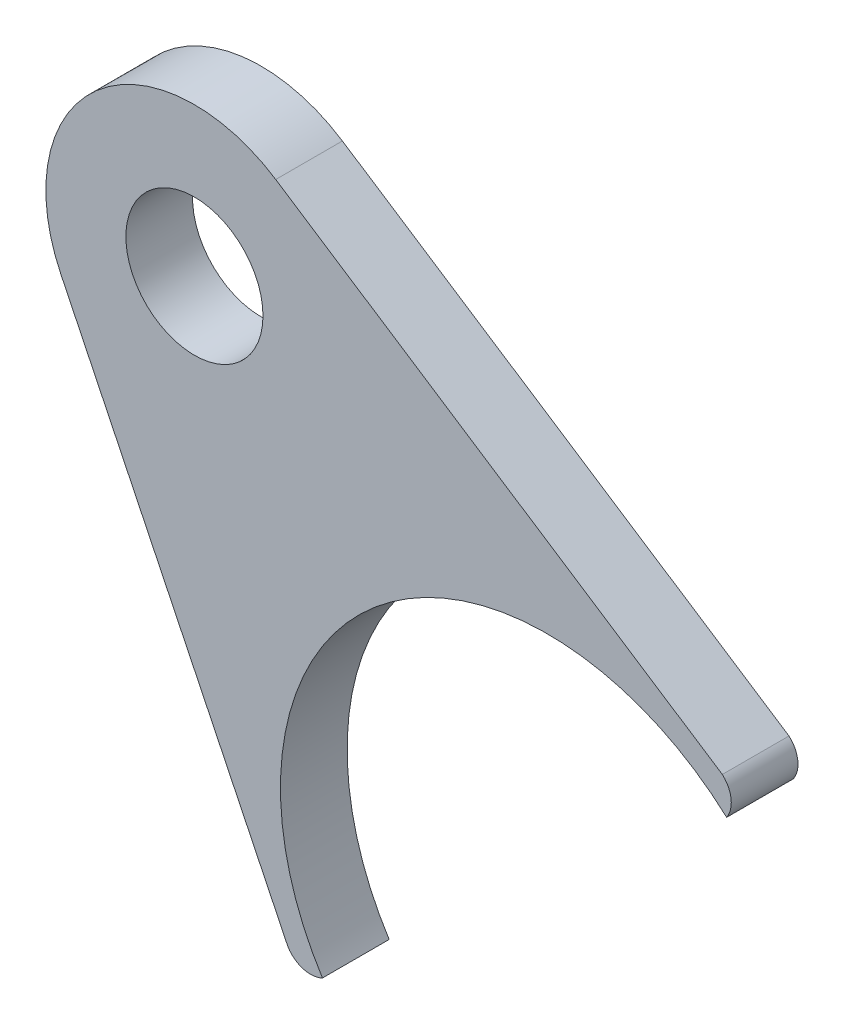
ISO-10303-21;
HEADER;
FILE_DESCRIPTION(('STEP AP214'),'2;1');
FILE_NAME('part.step','',(''),(''),'','','');
FILE_SCHEMA(('AUTOMOTIVE_DESIGN { 1 0 10303 214 1 1 1 1 }'));
ENDSEC;
DATA;
#1=APPLICATION_CONTEXT('core data for automotive mechanical design processes');
#2=APPLICATION_PROTOCOL_DEFINITION('international standard','automotive_design',2000,#1);
#3=PRODUCT_CONTEXT('',#1,'mechanical');
#4=PRODUCT('Part','Part','',(#3));
#5=PRODUCT_RELATED_PRODUCT_CATEGORY('part','',(#4));
#6=PRODUCT_DEFINITION_FORMATION('','',#4);
#7=PRODUCT_DEFINITION_CONTEXT('part definition',#1,'design');
#8=PRODUCT_DEFINITION('design','',#6,#7);
#9=PRODUCT_DEFINITION_SHAPE('','',#8);
#10=(LENGTH_UNIT() NAMED_UNIT(*) SI_UNIT(.MILLI.,.METRE.));
#11=(NAMED_UNIT(*) PLANE_ANGLE_UNIT() SI_UNIT($,.RADIAN.));
#12=(NAMED_UNIT(*) SI_UNIT($,.STERADIAN.) SOLID_ANGLE_UNIT());
#13=UNCERTAINTY_MEASURE_WITH_UNIT(LENGTH_MEASURE(1.E-05),#10,'distance_accuracy_value','');
#14=(GEOMETRIC_REPRESENTATION_CONTEXT(3) GLOBAL_UNCERTAINTY_ASSIGNED_CONTEXT((#13)) GLOBAL_UNIT_ASSIGNED_CONTEXT((#10,
#11,#12)) REPRESENTATION_CONTEXT('',''));
#15=CARTESIAN_POINT('',(0.,0.,0.));
#16=DIRECTION('',(0.,0.,1.));
#17=DIRECTION('',(1.,0.,0.));
#18=AXIS2_PLACEMENT_3D('',#15,#16,#17);
#19=CARTESIAN_POINT('',(7.490430135458,10.1196279800235,3.175));
#20=DIRECTION('',(0.,0.,1.));
#21=DIRECTION('',(1.,0.,0.));
#22=AXIS2_PLACEMENT_3D('',#19,#20,#21);
#23=PLANE('',#22);
#24=CARTESIAN_POINT('',(7.490430135458,10.1196279800235,3.175));
#25=DIRECTION('',(0.,0.,1.));
#26=DIRECTION('',(1.,0.,0.));
#27=AXIS2_PLACEMENT_3D('',#24,#25,#26);
#28=CIRCLE('',#27,1.27000000000002);
#29=CARTESIAN_POINT('',(8.54057723093058,9.40542137275168,3.175));
#30=VERTEX_POINT('',#29);
#31=CARTESIAN_POINT('',(8.33283083199815,11.0700284569114,3.175));
#32=VERTEX_POINT('',#31);
#33=EDGE_CURVE('E161',#30,#32,#28,.T.);
#34=ORIENTED_EDGE('',*,*,#33,.T.);
#35=DIRECTION('',(-0.836997984145,0.54720597085303,0.));
#36=VECTOR('',#35,1.);
#37=CARTESIAN_POINT('',(8.33283083199815,11.0700284569114,3.175));
#38=LINE('',#37,#36);
#39=CARTESIAN_POINT('',(-12.9296405080321,24.9708400392011,3.175));
#40=VERTEX_POINT('',#39);
#41=EDGE_CURVE('E108',#32,#40,#38,.T.);
#42=ORIENTED_EDGE('',*,*,#41,.T.);
#43=CARTESIAN_POINT('',(-16.8005208252494,19.0499999991578,3.175));
#44=DIRECTION('',(0.,0.,1.));
#45=DIRECTION('',(1.,0.,0.));
#46=AXIS2_PLACEMENT_3D('',#43,#44,#45);
#47=CIRCLE('',#46,7.07390000000001);
#48=CARTESIAN_POINT('',(-23.1672470230934,15.9670049080677,3.175));
#49=VERTEX_POINT('',#48);
#50=EDGE_CURVE('E121',#40,#49,#47,.T.);
#51=ORIENTED_EDGE('',*,*,#50,.T.);
#52=DIRECTION('',(0.435826784530473,-0.90003056275097,0.));
#53=VECTOR('',#52,1.);
#54=CARTESIAN_POINT('',(-12.3465290808871,-6.37897566167989,3.175));
#55=LINE('',#54,#53);
#56=CARTESIAN_POINT('',(-12.3465290808871,-6.3789756616799,3.175));
#57=VERTEX_POINT('',#56);
#58=EDGE_CURVE('E115',#49,#57,#55,.T.);
#59=ORIENTED_EDGE('',*,*,#58,.T.);
#60=CARTESIAN_POINT('',(-11.2701074977406,-5.7050197466999,3.175));
#61=DIRECTION('',(0.,0.,1.));
#62=DIRECTION('',(1.,0.,0.));
#63=AXIS2_PLACEMENT_3D('',#60,#61,#62);
#64=CIRCLE('',#63,1.27000000000005);
#65=CARTESIAN_POINT('',(-10.7045899306855,-6.84216084671875,3.175));
#66=VERTEX_POINT('',#65);
#67=EDGE_CURVE('E119',#57,#66,#64,.T.);
#68=ORIENTED_EDGE('',*,*,#67,.T.);
#69=CARTESIAN_POINT('',(0.,0.,3.175));
#70=DIRECTION('',(0.,0.,-1.));
#71=DIRECTION('',(1.,0.,0.));
#72=AXIS2_PLACEMENT_3D('',#69,#70,#71);
#73=CIRCLE('',#72,12.7044642010792);
#74=EDGE_CURVE('E71',#66,#30,#73,.T.);
#75=ORIENTED_EDGE('',*,*,#74,.T.);
#76=EDGE_LOOP('',(#34,#42,#51,#59,#68,#75));
#77=FACE_BOUND('',#76,.T.);
#78=CARTESIAN_POINT('',(-16.8005208252494,19.0499999991578,3.175));
#79=DIRECTION('',(0.,0.,1.));
#80=DIRECTION('',(1.,0.,0.));
#81=AXIS2_PLACEMENT_3D('',#78,#79,#80);
#82=CIRCLE('',#81,3.26390000000004);
#83=CARTESIAN_POINT('',(-13.5366208252493,19.0499999991578,3.175));
#84=VERTEX_POINT('',#83);
#85=EDGE_CURVE('E149',#84,#84,#82,.T.);
#86=ORIENTED_EDGE('',*,*,#85,.F.);
#87=EDGE_LOOP('',(#86));
#88=FACE_BOUND('',#87,.T.);
#89=ADVANCED_FACE('F53',(#77,#88),#23,.T.);
#90=CARTESIAN_POINT('',(7.490430135458,10.1196279800235,0.));
#91=DIRECTION('',(0.,0.,1.));
#92=DIRECTION('',(1.,0.,0.));
#93=AXIS2_PLACEMENT_3D('',#90,#91,#92);
#94=PLANE('',#93);
#95=CARTESIAN_POINT('',(7.490430135458,10.1196279800235,0.));
#96=DIRECTION('',(0.,0.,1.));
#97=DIRECTION('',(1.,0.,0.));
#98=AXIS2_PLACEMENT_3D('',#95,#96,#97);
#99=CIRCLE('',#98,1.27000000000002);
#100=CARTESIAN_POINT('',(8.54057723093058,9.40542137275168,0.));
#101=VERTEX_POINT('',#100);
#102=CARTESIAN_POINT('',(8.33283083199815,11.0700284569114,0.));
#103=VERTEX_POINT('',#102);
#104=EDGE_CURVE('E144',#101,#103,#99,.T.);
#105=ORIENTED_EDGE('',*,*,#104,.F.);
#106=CARTESIAN_POINT('',(0.,0.,0.));
#107=DIRECTION('',(0.,0.,-1.));
#108=DIRECTION('',(1.,0.,0.));
#109=AXIS2_PLACEMENT_3D('',#106,#107,#108);
#110=CIRCLE('',#109,12.7044642010792);
#111=CARTESIAN_POINT('',(-10.7045899306855,-6.84216084671875,0.));
#112=VERTEX_POINT('',#111);
#113=EDGE_CURVE('E100',#112,#101,#110,.T.);
#114=ORIENTED_EDGE('',*,*,#113,.F.);
#115=CARTESIAN_POINT('',(-11.2701074977406,-5.7050197466999,0.));
#116=DIRECTION('',(0.,0.,1.));
#117=DIRECTION('',(1.,0.,0.));
#118=AXIS2_PLACEMENT_3D('',#115,#116,#117);
#119=CIRCLE('',#118,1.27000000000005);
#120=CARTESIAN_POINT('',(-12.3465290808871,-6.3789756616799,0.));
#121=VERTEX_POINT('',#120);
#122=EDGE_CURVE('E94',#121,#112,#119,.T.);
#123=ORIENTED_EDGE('',*,*,#122,.F.);
#124=DIRECTION('',(0.435826784530473,-0.90003056275097,0.));
#125=VECTOR('',#124,1.);
#126=CARTESIAN_POINT('',(-12.3465290808871,-6.37897566167989,0.));
#127=LINE('',#126,#125);
#128=CARTESIAN_POINT('',(-23.1672470230934,15.9670049080677,0.));
#129=VERTEX_POINT('',#128);
#130=EDGE_CURVE('E130',#129,#121,#127,.T.);
#131=ORIENTED_EDGE('',*,*,#130,.F.);
#132=CARTESIAN_POINT('',(-16.8005208252494,19.0499999991578,0.));
#133=DIRECTION('',(0.,0.,1.));
#134=DIRECTION('',(1.,0.,0.));
#135=AXIS2_PLACEMENT_3D('',#132,#133,#134);
#136=CIRCLE('',#135,7.07390000000001);
#137=CARTESIAN_POINT('',(-12.9296405080321,24.9708400392011,0.));
#138=VERTEX_POINT('',#137);
#139=EDGE_CURVE('E152',#138,#129,#136,.T.);
#140=ORIENTED_EDGE('',*,*,#139,.F.);
#141=DIRECTION('',(-0.836997984145,0.54720597085303,0.));
#142=VECTOR('',#141,1.);
#143=CARTESIAN_POINT('',(8.33283083199815,11.0700284569114,0.));
#144=LINE('',#143,#142);
#145=EDGE_CURVE('E148',#103,#138,#144,.T.);
#146=ORIENTED_EDGE('',*,*,#145,.F.);
#147=EDGE_LOOP('',(#105,#114,#123,#131,#140,#146));
#148=FACE_BOUND('',#147,.T.);
#149=CARTESIAN_POINT('',(-16.8005208252494,19.0499999991578,0.));
#150=DIRECTION('',(0.,0.,1.));
#151=DIRECTION('',(1.,0.,0.));
#152=AXIS2_PLACEMENT_3D('',#149,#150,#151);
#153=CIRCLE('',#152,3.26390000000004);
#154=CARTESIAN_POINT('',(-13.5366208252493,19.0499999991578,0.));
#155=VERTEX_POINT('',#154);
#156=EDGE_CURVE('E259',#155,#155,#153,.T.);
#157=ORIENTED_EDGE('',*,*,#156,.T.);
#158=EDGE_LOOP('',(#157));
#159=FACE_BOUND('',#158,.T.);
#160=ADVANCED_FACE('F175',(#148,#159),#94,.F.);
#161=CARTESIAN_POINT('',(7.490430135458,10.1196279800235,3.175));
#162=DIRECTION('',(0.,0.,-1.));
#163=DIRECTION('',(-1.,0.,0.));
#164=AXIS2_PLACEMENT_3D('',#161,#162,#163);
#165=CYLINDRICAL_SURFACE('',#164,1.27000000000002);
#166=ORIENTED_EDGE('',*,*,#104,.T.);
#167=DIRECTION('',(0.,0.,-1.));
#168=VECTOR('',#167,1.);
#169=CARTESIAN_POINT('',(8.33283083199815,11.0700284569114,3.175));
#170=LINE('',#169,#168);
#171=EDGE_CURVE('E13',#32,#103,#170,.T.);
#172=ORIENTED_EDGE('',*,*,#171,.F.);
#173=ORIENTED_EDGE('',*,*,#33,.F.);
#174=DIRECTION('',(0.,0.,-1.));
#175=VECTOR('',#174,1.);
#176=CARTESIAN_POINT('',(8.54057723093058,9.40542137275168,3.175));
#177=LINE('',#176,#175);
#178=EDGE_CURVE('E140',#30,#101,#177,.T.);
#179=ORIENTED_EDGE('',*,*,#178,.T.);
#180=EDGE_LOOP('',(#166,#172,#173,#179));
#181=FACE_BOUND('',#180,.T.);
#182=ADVANCED_FACE('F55',(#181),#165,.T.);
#183=CARTESIAN_POINT('',(8.33283083199815,11.0700284569114,3.175));
#184=DIRECTION('',(-0.54720597085303,-0.836997984145,0.));
#185=DIRECTION('',(0.836997984145,-0.54720597085303,0.));
#186=AXIS2_PLACEMENT_3D('',#183,#184,#185);
#187=PLANE('',#186);
#188=ORIENTED_EDGE('',*,*,#145,.T.);
#189=DIRECTION('',(0.,0.,-1.));
#190=VECTOR('',#189,1.);
#191=CARTESIAN_POINT('',(-12.9296405080321,24.9708400392011,3.175));
#192=LINE('',#191,#190);
#193=EDGE_CURVE('E63',#40,#138,#192,.T.);
#194=ORIENTED_EDGE('',*,*,#193,.F.);
#195=ORIENTED_EDGE('',*,*,#41,.F.);
#196=ORIENTED_EDGE('',*,*,#171,.T.);
#197=EDGE_LOOP('',(#188,#194,#195,#196));
#198=FACE_BOUND('',#197,.T.);
#199=ADVANCED_FACE('F200',(#198),#187,.F.);
#200=CARTESIAN_POINT('',(-16.8005208252494,19.0499999991578,3.175));
#201=DIRECTION('',(0.,0.,-1.));
#202=DIRECTION('',(-1.,0.,0.));
#203=AXIS2_PLACEMENT_3D('',#200,#201,#202);
#204=CYLINDRICAL_SURFACE('',#203,7.07390000000001);
#205=ORIENTED_EDGE('',*,*,#139,.T.);
#206=DIRECTION('',(0.,0.,-1.));
#207=VECTOR('',#206,1.);
#208=CARTESIAN_POINT('',(-23.1672470230934,15.9670049080677,3.175));
#209=LINE('',#208,#207);
#210=EDGE_CURVE('E132',#49,#129,#209,.T.);
#211=ORIENTED_EDGE('',*,*,#210,.F.);
#212=ORIENTED_EDGE('',*,*,#50,.F.);
#213=ORIENTED_EDGE('',*,*,#193,.T.);
#214=EDGE_LOOP('',(#205,#211,#212,#213));
#215=FACE_BOUND('',#214,.T.);
#216=ADVANCED_FACE('F172',(#215),#204,.T.);
#217=CARTESIAN_POINT('',(-12.3465290808871,-6.37897566167989,3.175));
#218=DIRECTION('',(0.900030562750971,0.435826784530473,0.));
#219=DIRECTION('',(-0.435826784530473,0.900030562750971,0.));
#220=AXIS2_PLACEMENT_3D('',#217,#218,#219);
#221=PLANE('',#220);
#222=ORIENTED_EDGE('',*,*,#130,.T.);
#223=DIRECTION('',(0.,0.,-1.));
#224=VECTOR('',#223,1.);
#225=CARTESIAN_POINT('',(-12.3465290808871,-6.3789756616799,3.175));
#226=LINE('',#225,#224);
#227=EDGE_CURVE('E127',#57,#121,#226,.T.);
#228=ORIENTED_EDGE('',*,*,#227,.F.);
#229=ORIENTED_EDGE('',*,*,#58,.F.);
#230=ORIENTED_EDGE('',*,*,#210,.T.);
#231=EDGE_LOOP('',(#222,#228,#229,#230));
#232=FACE_BOUND('',#231,.T.);
#233=ADVANCED_FACE('F128',(#232),#221,.F.);
#234=CARTESIAN_POINT('',(-11.2701074977406,-5.7050197466999,3.175));
#235=DIRECTION('',(0.,0.,-1.));
#236=DIRECTION('',(-1.,0.,0.));
#237=AXIS2_PLACEMENT_3D('',#234,#235,#236);
#238=CYLINDRICAL_SURFACE('',#237,1.27000000000005);
#239=ORIENTED_EDGE('',*,*,#122,.T.);
#240=DIRECTION('',(0.,0.,-1.));
#241=VECTOR('',#240,1.);
#242=CARTESIAN_POINT('',(-10.7045899306855,-6.84216084671875,3.175));
#243=LINE('',#242,#241);
#244=EDGE_CURVE('E133',#66,#112,#243,.T.);
#245=ORIENTED_EDGE('',*,*,#244,.F.);
#246=ORIENTED_EDGE('',*,*,#67,.F.);
#247=ORIENTED_EDGE('',*,*,#227,.T.);
#248=EDGE_LOOP('',(#239,#245,#246,#247));
#249=FACE_BOUND('',#248,.T.);
#250=ADVANCED_FACE('F135',(#249),#238,.T.);
#251=CARTESIAN_POINT('',(0.,0.,3.175));
#252=DIRECTION('',(0.,0.,-1.));
#253=DIRECTION('',(-1.,0.,0.));
#254=AXIS2_PLACEMENT_3D('',#251,#252,#253);
#255=CYLINDRICAL_SURFACE('',#254,12.7044642010792);
#256=ORIENTED_EDGE('',*,*,#113,.T.);
#257=ORIENTED_EDGE('',*,*,#178,.F.);
#258=ORIENTED_EDGE('',*,*,#74,.F.);
#259=ORIENTED_EDGE('',*,*,#244,.T.);
#260=EDGE_LOOP('',(#256,#257,#258,#259));
#261=FACE_BOUND('',#260,.T.);
#262=ADVANCED_FACE('F180',(#261),#255,.F.);
#263=CARTESIAN_POINT('',(-16.8005208252494,19.0499999991578,3.175));
#264=DIRECTION('',(0.,0.,-1.));
#265=DIRECTION('',(-1.,0.,0.));
#266=AXIS2_PLACEMENT_3D('',#263,#264,#265);
#267=CYLINDRICAL_SURFACE('',#266,3.26390000000004);
#268=ORIENTED_EDGE('',*,*,#85,.T.);
#269=EDGE_LOOP('',(#268));
#270=FACE_BOUND('',#269,.T.);
#271=ORIENTED_EDGE('',*,*,#156,.F.);
#272=EDGE_LOOP('',(#271));
#273=FACE_BOUND('',#272,.T.);
#274=ADVANCED_FACE('F182',(#270,#273),#267,.F.);
#275=CLOSED_SHELL('',(#89,#160,#182,#199,#216,#233,#250,#262,#274));
#276=MANIFOLD_SOLID_BREP('B2',#275);
#277=ADVANCED_BREP_SHAPE_REPRESENTATION('',(#18,#276),#14);
#278=SHAPE_DEFINITION_REPRESENTATION(#9,#277);
ENDSEC;
END-ISO-10303-21;
